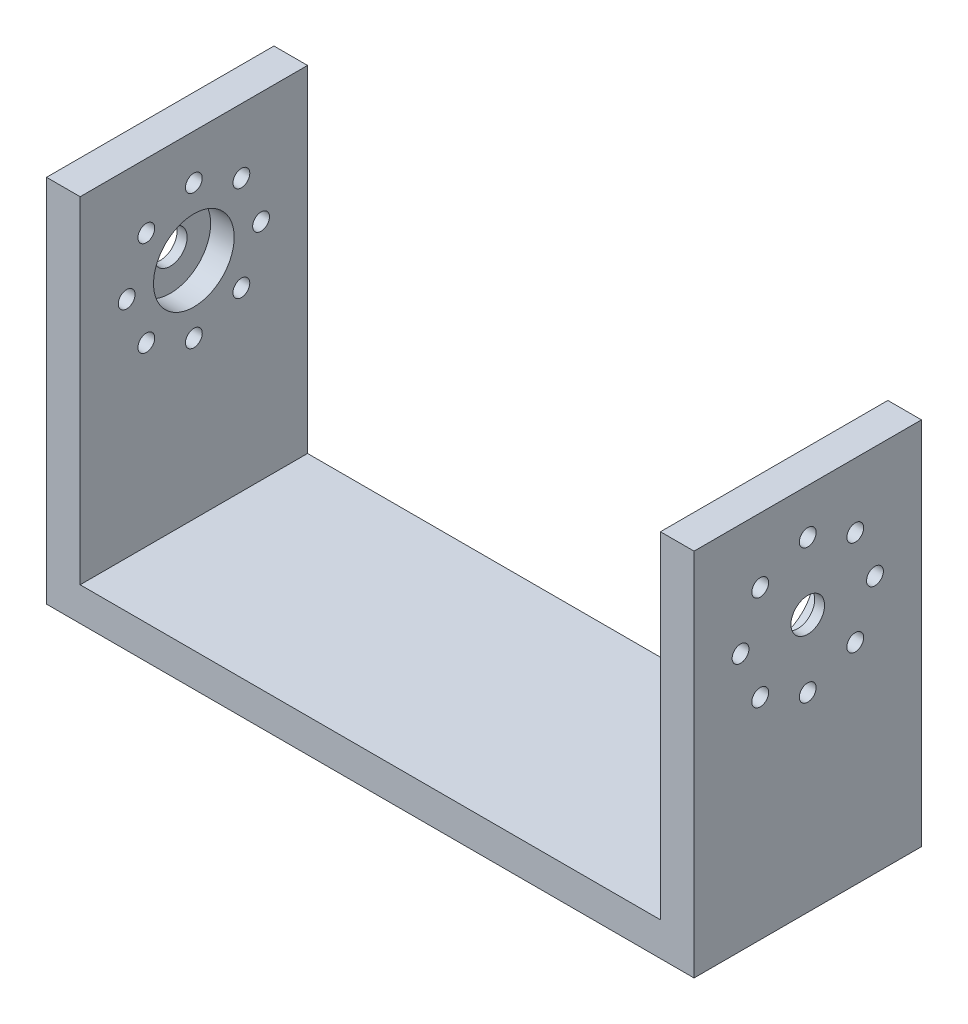
ISO-10303-21;
HEADER;
FILE_DESCRIPTION(('STEP AP214'),'2;1');
FILE_NAME('part.step','',(''),(''),'','','');
FILE_SCHEMA(('AUTOMOTIVE_DESIGN { 1 0 10303 214 1 1 1 1 }'));
ENDSEC;
DATA;
#1=APPLICATION_CONTEXT('core data for automotive mechanical design processes');
#2=APPLICATION_PROTOCOL_DEFINITION('international standard','automotive_design',2000,#1);
#3=PRODUCT_CONTEXT('',#1,'mechanical');
#4=PRODUCT('Part','Part','',(#3));
#5=PRODUCT_RELATED_PRODUCT_CATEGORY('part','',(#4));
#6=PRODUCT_DEFINITION_FORMATION('','',#4);
#7=PRODUCT_DEFINITION_CONTEXT('part definition',#1,'design');
#8=PRODUCT_DEFINITION('design','',#6,#7);
#9=PRODUCT_DEFINITION_SHAPE('','',#8);
#10=(LENGTH_UNIT() NAMED_UNIT(*) SI_UNIT(.MILLI.,.METRE.));
#11=(NAMED_UNIT(*) PLANE_ANGLE_UNIT() SI_UNIT($,.RADIAN.));
#12=(NAMED_UNIT(*) SI_UNIT($,.STERADIAN.) SOLID_ANGLE_UNIT());
#13=UNCERTAINTY_MEASURE_WITH_UNIT(LENGTH_MEASURE(1.E-05),#10,'distance_accuracy_value','');
#14=(GEOMETRIC_REPRESENTATION_CONTEXT(3) GLOBAL_UNCERTAINTY_ASSIGNED_CONTEXT((#13)) GLOBAL_UNIT_ASSIGNED_CONTEXT((#10,
#11,#12)) REPRESENTATION_CONTEXT('',''));
#15=CARTESIAN_POINT('',(0.,0.,0.));
#16=DIRECTION('',(0.,0.,1.));
#17=DIRECTION('',(1.,0.,0.));
#18=AXIS2_PLACEMENT_3D('',#15,#16,#17);
#19=CARTESIAN_POINT('',(-4.2426406871193,23.,-10.15));
#20=DIRECTION('',(1.,0.,0.));
#21=DIRECTION('',(0.,0.,-0.999999999999999));
#22=AXIS2_PLACEMENT_3D('',#19,#20,#21);
#23=CYLINDRICAL_SURFACE('',#22,1.5);
#24=CARTESIAN_POINT('',(0.,22.9999999999999,-10.15));
#25=DIRECTION('',(1.,0.,0.));
#26=DIRECTION('',(0.,0.,-0.999999999999999));
#27=AXIS2_PLACEMENT_3D('',#24,#25,#26);
#28=CIRCLE('',#27,1.5);
#29=CARTESIAN_POINT('',(0.,22.9999999999999,-11.65));
#30=VERTEX_POINT('',#29);
#31=EDGE_CURVE('E184',#30,#30,#28,.F.);
#32=ORIENTED_EDGE('',*,*,#31,.T.);
#33=EDGE_LOOP('',(#32));
#34=FACE_BOUND('',#33,.T.);
#35=CARTESIAN_POINT('',(0.900000000000012,23.,-10.15));
#36=DIRECTION('',(1.,0.,0.));
#37=DIRECTION('',(0.,0.,-0.999999999999999));
#38=AXIS2_PLACEMENT_3D('',#35,#36,#37);
#39=CIRCLE('',#38,1.5);
#40=CARTESIAN_POINT('',(0.900000000000013,23.,-11.65));
#41=VERTEX_POINT('',#40);
#42=EDGE_CURVE('E49',#41,#41,#39,.F.);
#43=ORIENTED_EDGE('',*,*,#42,.F.);
#44=EDGE_LOOP('',(#43));
#45=FACE_BOUND('',#44,.T.);
#46=ADVANCED_FACE('F45',(#34,#45),#23,.F.);
#47=CARTESIAN_POINT('',(57.8000000000001,22.9999999999998,-10.15));
#48=DIRECTION('',(1.,0.,0.));
#49=DIRECTION('',(0.,0.,-0.999999999999999));
#50=AXIS2_PLACEMENT_3D('',#47,#48,#49);
#51=CIRCLE('',#50,1.5);
#52=CARTESIAN_POINT('',(57.8000000000001,22.9999999999998,-11.65));
#53=VERTEX_POINT('',#52);
#54=EDGE_CURVE('E259',#53,#53,#51,.T.);
#55=ORIENTED_EDGE('',*,*,#54,.T.);
#56=EDGE_LOOP('',(#55));
#57=FACE_BOUND('',#56,.T.);
#58=CARTESIAN_POINT('',(56.9200000000001,22.9999999999998,-10.15));
#59=DIRECTION('',(-1.,0.,0.));
#60=DIRECTION('',(0.,0.,0.999999999999999));
#61=AXIS2_PLACEMENT_3D('',#58,#59,#60);
#62=CIRCLE('',#61,1.5);
#63=CARTESIAN_POINT('',(56.9200000000001,22.9999999999998,-8.65000000000003));
#64=VERTEX_POINT('',#63);
#65=EDGE_CURVE('E211',#64,#64,#62,.F.);
#66=ORIENTED_EDGE('',*,*,#65,.F.);
#67=EDGE_LOOP('',(#66));
#68=FACE_BOUND('',#67,.T.);
#69=ADVANCED_FACE('F319',(#57,#68),#23,.F.);
#70=CARTESIAN_POINT('',(0.,3.,0.));
#71=DIRECTION('',(0.,-0.999999999999998,0.));
#72=DIRECTION('',(0.,0.,-0.999999999999999));
#73=AXIS2_PLACEMENT_3D('',#70,#71,#72);
#74=PLANE('',#73);
#75=DIRECTION('',(0.,0.,0.999999999999999));
#76=VECTOR('',#75,1.);
#77=CARTESIAN_POINT('',(54.8000000000001,2.99999999999989,-20.2999999999999));
#78=LINE('',#77,#76);
#79=CARTESIAN_POINT('',(54.8000000000001,2.99999999999989,-20.2999999999999));
#80=VERTEX_POINT('',#79);
#81=CARTESIAN_POINT('',(54.8000000000001,2.99999999999988,0.));
#82=VERTEX_POINT('',#81);
#83=EDGE_CURVE('E136',#80,#82,#78,.T.);
#84=ORIENTED_EDGE('',*,*,#83,.F.);
#85=DIRECTION('',(-1.,0.,0.));
#86=VECTOR('',#85,1.);
#87=CARTESIAN_POINT('',(0.,3.,-20.3));
#88=LINE('',#87,#86);
#89=CARTESIAN_POINT('',(3.,3.,-20.3));
#90=VERTEX_POINT('',#89);
#91=EDGE_CURVE('E168',#80,#90,#88,.T.);
#92=ORIENTED_EDGE('',*,*,#91,.T.);
#93=DIRECTION('',(0.,0.,-0.999999999999999));
#94=VECTOR('',#93,1.);
#95=CARTESIAN_POINT('',(3.,3.,-20.3));
#96=LINE('',#95,#94);
#97=CARTESIAN_POINT('',(3.,3.,0.));
#98=VERTEX_POINT('',#97);
#99=EDGE_CURVE('E67',#98,#90,#96,.T.);
#100=ORIENTED_EDGE('',*,*,#99,.F.);
#101=DIRECTION('',(1.,0.,0.));
#102=VECTOR('',#101,1.);
#103=CARTESIAN_POINT('',(0.,3.,0.));
#104=LINE('',#103,#102);
#105=EDGE_CURVE('E62',#98,#82,#104,.T.);
#106=ORIENTED_EDGE('',*,*,#105,.T.);
#107=EDGE_LOOP('',(#84,#92,#100,#106));
#108=FACE_BOUND('',#107,.T.);
#109=ADVANCED_FACE('F325',(#108),#74,.F.);
#110=CARTESIAN_POINT('',(0.,3.,0.));
#111=DIRECTION('',(1.,0.,0.));
#112=DIRECTION('',(0.,0.,-0.999999999999999));
#113=AXIS2_PLACEMENT_3D('',#110,#111,#112);
#114=PLANE('',#113);
#115=CARTESIAN_POINT('',(0.,23.,-16.15));
#116=DIRECTION('',(1.,0.,0.));
#117=DIRECTION('',(0.,0.,-0.999999999999999));
#118=AXIS2_PLACEMENT_3D('',#115,#116,#117);
#119=CIRCLE('',#118,0.750000000000002);
#120=CARTESIAN_POINT('',(0.,23.,-16.9));
#121=VERTEX_POINT('',#120);
#122=EDGE_CURVE('E255',#121,#121,#119,.F.);
#123=ORIENTED_EDGE('',*,*,#122,.F.);
#124=EDGE_LOOP('',(#123));
#125=FACE_BOUND('',#124,.T.);
#126=CARTESIAN_POINT('',(0.,18.7573593128807,-14.3926406871193));
#127=DIRECTION('',(1.,0.,0.));
#128=DIRECTION('',(0.,0.,-0.999999999999999));
#129=AXIS2_PLACEMENT_3D('',#126,#127,#128);
#130=CIRCLE('',#129,0.750000000000007);
#131=CARTESIAN_POINT('',(0.,18.7573593128807,-15.1426406871193));
#132=VERTEX_POINT('',#131);
#133=EDGE_CURVE('E256',#132,#132,#130,.F.);
#134=ORIENTED_EDGE('',*,*,#133,.F.);
#135=EDGE_LOOP('',(#134));
#136=FACE_BOUND('',#135,.T.);
#137=CARTESIAN_POINT('',(0.,17.,-10.15));
#138=DIRECTION('',(1.,0.,0.));
#139=DIRECTION('',(0.,0.,-0.999999999999999));
#140=AXIS2_PLACEMENT_3D('',#137,#138,#139);
#141=CIRCLE('',#140,0.75);
#142=CARTESIAN_POINT('',(0.,17.,-10.9));
#143=VERTEX_POINT('',#142);
#144=EDGE_CURVE('E263',#143,#143,#141,.F.);
#145=ORIENTED_EDGE('',*,*,#144,.F.);
#146=EDGE_LOOP('',(#145));
#147=FACE_BOUND('',#146,.T.);
#148=CARTESIAN_POINT('',(0.,18.7573593128807,-5.90735931288071));
#149=DIRECTION('',(1.,0.,0.));
#150=DIRECTION('',(0.,0.,-0.999999999999999));
#151=AXIS2_PLACEMENT_3D('',#148,#149,#150);
#152=CIRCLE('',#151,0.750000000000002);
#153=CARTESIAN_POINT('',(0.,18.7573593128807,-6.65735931288071));
#154=VERTEX_POINT('',#153);
#155=EDGE_CURVE('E269',#154,#154,#152,.F.);
#156=ORIENTED_EDGE('',*,*,#155,.F.);
#157=EDGE_LOOP('',(#156));
#158=FACE_BOUND('',#157,.T.);
#159=CARTESIAN_POINT('',(0.,23.,-4.15));
#160=DIRECTION('',(1.,0.,0.));
#161=DIRECTION('',(0.,0.,-0.999999999999999));
#162=AXIS2_PLACEMENT_3D('',#159,#160,#161);
#163=CIRCLE('',#162,0.750000000000004);
#164=CARTESIAN_POINT('',(0.,23.,-4.9));
#165=VERTEX_POINT('',#164);
#166=EDGE_CURVE('E234',#165,#165,#163,.F.);
#167=ORIENTED_EDGE('',*,*,#166,.F.);
#168=EDGE_LOOP('',(#167));
#169=FACE_BOUND('',#168,.T.);
#170=CARTESIAN_POINT('',(0.,27.2426406871193,-5.90735931288069));
#171=DIRECTION('',(1.,0.,0.));
#172=DIRECTION('',(0.,0.,-0.999999999999999));
#173=AXIS2_PLACEMENT_3D('',#170,#171,#172);
#174=CIRCLE('',#173,0.750000000000004);
#175=CARTESIAN_POINT('',(0.,27.2426406871193,-6.6573593128807));
#176=VERTEX_POINT('',#175);
#177=EDGE_CURVE('E235',#176,#176,#174,.F.);
#178=ORIENTED_EDGE('',*,*,#177,.F.);
#179=EDGE_LOOP('',(#178));
#180=FACE_BOUND('',#179,.T.);
#181=CARTESIAN_POINT('',(0.,29.,-10.15));
#182=DIRECTION('',(1.,0.,0.));
#183=DIRECTION('',(0.,0.,-0.999999999999999));
#184=AXIS2_PLACEMENT_3D('',#181,#182,#183);
#185=CIRCLE('',#184,0.750000000000004);
#186=CARTESIAN_POINT('',(0.,29.,-10.9));
#187=VERTEX_POINT('',#186);
#188=EDGE_CURVE('E242',#187,#187,#185,.F.);
#189=ORIENTED_EDGE('',*,*,#188,.F.);
#190=EDGE_LOOP('',(#189));
#191=FACE_BOUND('',#190,.T.);
#192=CARTESIAN_POINT('',(0.,27.2426406871193,-14.3926406871193));
#193=DIRECTION('',(1.,0.,0.));
#194=DIRECTION('',(0.,0.,-0.999999999999999));
#195=AXIS2_PLACEMENT_3D('',#192,#193,#194);
#196=CIRCLE('',#195,0.750000000000002);
#197=CARTESIAN_POINT('',(0.,27.2426406871193,-15.1426406871193));
#198=VERTEX_POINT('',#197);
#199=EDGE_CURVE('E218',#198,#198,#196,.F.);
#200=ORIENTED_EDGE('',*,*,#199,.F.);
#201=EDGE_LOOP('',(#200));
#202=FACE_BOUND('',#201,.T.);
#203=ORIENTED_EDGE('',*,*,#31,.F.);
#204=EDGE_LOOP('',(#203));
#205=FACE_BOUND('',#204,.T.);
#206=DIRECTION('',(0.,0.,0.999999999999999));
#207=VECTOR('',#206,1.);
#208=CARTESIAN_POINT('',(0.,0.,0.));
#209=LINE('',#208,#207);
#210=CARTESIAN_POINT('',(0.,0.,-20.3));
#211=VERTEX_POINT('',#210);
#212=CARTESIAN_POINT('',(0.,0.,0.));
#213=VERTEX_POINT('',#212);
#214=EDGE_CURVE('E166',#211,#213,#209,.T.);
#215=ORIENTED_EDGE('',*,*,#214,.T.);
#216=DIRECTION('',(0.,-0.999999999999998,0.));
#217=VECTOR('',#216,1.);
#218=CARTESIAN_POINT('',(0.,3.,0.));
#219=LINE('',#218,#217);
#220=CARTESIAN_POINT('',(0.,33.,0.));
#221=VERTEX_POINT('',#220);
#222=EDGE_CURVE('E13',#221,#213,#219,.T.);
#223=ORIENTED_EDGE('',*,*,#222,.F.);
#224=DIRECTION('',(0.,0.,0.999999999999999));
#225=VECTOR('',#224,1.);
#226=CARTESIAN_POINT('',(0.,33.,-20.3));
#227=LINE('',#226,#225);
#228=CARTESIAN_POINT('',(0.,33.,-20.3));
#229=VERTEX_POINT('',#228);
#230=EDGE_CURVE('E149',#229,#221,#227,.T.);
#231=ORIENTED_EDGE('',*,*,#230,.F.);
#232=DIRECTION('',(0.,-0.999999999999998,0.));
#233=VECTOR('',#232,1.);
#234=CARTESIAN_POINT('',(0.,3.,-20.3));
#235=LINE('',#234,#233);
#236=EDGE_CURVE('E121',#229,#211,#235,.T.);
#237=ORIENTED_EDGE('',*,*,#236,.T.);
#238=EDGE_LOOP('',(#215,#223,#231,#237));
#239=FACE_BOUND('',#238,.T.);
#240=ADVANCED_FACE('F47',(#125,#136,#147,#158,#169,#180,#191,#202,#205,#239),#114,.F.);
#241=CARTESIAN_POINT('',(0.,3.,0.));
#242=DIRECTION('',(0.,0.,-0.999999999999999));
#243=DIRECTION('',(-1.,0.,0.));
#244=AXIS2_PLACEMENT_3D('',#241,#242,#243);
#245=PLANE('',#244);
#246=DIRECTION('',(1.,0.,0.));
#247=VECTOR('',#246,1.);
#248=CARTESIAN_POINT('',(0.,0.,0.));
#249=LINE('',#248,#247);
#250=CARTESIAN_POINT('',(57.8000000000001,-1.38777878078145E-13,0.));
#251=VERTEX_POINT('',#250);
#252=EDGE_CURVE('E173',#213,#251,#249,.T.);
#253=ORIENTED_EDGE('',*,*,#252,.T.);
#254=DIRECTION('',(0.,-0.999999999999998,0.));
#255=VECTOR('',#254,1.);
#256=CARTESIAN_POINT('',(57.8000000000001,2.99999999999996,0.));
#257=LINE('',#256,#255);
#258=CARTESIAN_POINT('',(57.8000000000001,32.9999999999998,0.));
#259=VERTEX_POINT('',#258);
#260=EDGE_CURVE('E54',#259,#251,#257,.T.);
#261=ORIENTED_EDGE('',*,*,#260,.F.);
#262=DIRECTION('',(1.,0.,0.));
#263=VECTOR('',#262,1.);
#264=CARTESIAN_POINT('',(57.8000000000001,32.9999999999998,0.));
#265=LINE('',#264,#263);
#266=CARTESIAN_POINT('',(54.8000000000001,32.9999999999998,0.));
#267=VERTEX_POINT('',#266);
#268=EDGE_CURVE('E135',#267,#259,#265,.T.);
#269=ORIENTED_EDGE('',*,*,#268,.F.);
#270=DIRECTION('',(0.,-0.999999999999998,0.));
#271=VECTOR('',#270,1.);
#272=CARTESIAN_POINT('',(54.8000000000001,32.9999999999998,0.));
#273=LINE('',#272,#271);
#274=EDGE_CURVE('E144',#267,#82,#273,.T.);
#275=ORIENTED_EDGE('',*,*,#274,.T.);
#276=ORIENTED_EDGE('',*,*,#105,.F.);
#277=DIRECTION('',(0.,-0.999999999999998,0.));
#278=VECTOR('',#277,1.);
#279=CARTESIAN_POINT('',(3.00000000000003,33.,0.));
#280=LINE('',#279,#278);
#281=CARTESIAN_POINT('',(3.00000000000003,33.,0.));
#282=VERTEX_POINT('',#281);
#283=EDGE_CURVE('E163',#282,#98,#280,.T.);
#284=ORIENTED_EDGE('',*,*,#283,.F.);
#285=DIRECTION('',(1.,0.,0.));
#286=VECTOR('',#285,1.);
#287=CARTESIAN_POINT('',(0.,33.,0.));
#288=LINE('',#287,#286);
#289=EDGE_CURVE('E152',#221,#282,#288,.T.);
#290=ORIENTED_EDGE('',*,*,#289,.F.);
#291=ORIENTED_EDGE('',*,*,#222,.T.);
#292=EDGE_LOOP('',(#253,#261,#269,#275,#276,#284,#290,#291));
#293=FACE_BOUND('',#292,.T.);
#294=ADVANCED_FACE('F353',(#293),#245,.F.);
#295=CARTESIAN_POINT('',(57.8000000000001,2.99999999999996,0.));
#296=DIRECTION('',(-1.,0.,0.));
#297=DIRECTION('',(0.,0.,0.999999999999999));
#298=AXIS2_PLACEMENT_3D('',#295,#296,#297);
#299=PLANE('',#298);
#300=CARTESIAN_POINT('',(57.8000000000001,22.9999999999999,-16.15));
#301=DIRECTION('',(1.,0.,0.));
#302=DIRECTION('',(0.,0.,-0.999999999999999));
#303=AXIS2_PLACEMENT_3D('',#300,#301,#302);
#304=CIRCLE('',#303,0.750000000000002);
#305=CARTESIAN_POINT('',(57.8000000000001,22.9999999999999,-16.9));
#306=VERTEX_POINT('',#305);
#307=EDGE_CURVE('E252',#306,#306,#304,.T.);
#308=ORIENTED_EDGE('',*,*,#307,.F.);
#309=EDGE_LOOP('',(#308));
#310=FACE_BOUND('',#309,.T.);
#311=CARTESIAN_POINT('',(57.8000000000001,18.7573593128806,-14.3926406871192));
#312=DIRECTION('',(1.,0.,0.));
#313=DIRECTION('',(0.,0.,-0.999999999999999));
#314=AXIS2_PLACEMENT_3D('',#311,#312,#313);
#315=CIRCLE('',#314,0.750000000000007);
#316=CARTESIAN_POINT('',(57.8000000000001,18.7573593128806,-15.1426406871192));
#317=VERTEX_POINT('',#316);
#318=EDGE_CURVE('E260',#317,#317,#315,.T.);
#319=ORIENTED_EDGE('',*,*,#318,.F.);
#320=EDGE_LOOP('',(#319));
#321=FACE_BOUND('',#320,.T.);
#322=CARTESIAN_POINT('',(57.8000000000001,16.9999999999999,-10.15));
#323=DIRECTION('',(1.,0.,0.));
#324=DIRECTION('',(0.,0.,-0.999999999999999));
#325=AXIS2_PLACEMENT_3D('',#322,#323,#324);
#326=CIRCLE('',#325,0.75);
#327=CARTESIAN_POINT('',(57.8000000000001,16.9999999999999,-10.9));
#328=VERTEX_POINT('',#327);
#329=EDGE_CURVE('E266',#328,#328,#326,.T.);
#330=ORIENTED_EDGE('',*,*,#329,.F.);
#331=EDGE_LOOP('',(#330));
#332=FACE_BOUND('',#331,.T.);
#333=CARTESIAN_POINT('',(57.8000000000001,18.7573593128805,-5.90735931288075));
#334=DIRECTION('',(1.,0.,0.));
#335=DIRECTION('',(0.,0.,-0.999999999999999));
#336=AXIS2_PLACEMENT_3D('',#333,#334,#335);
#337=CIRCLE('',#336,0.750000000000002);
#338=CARTESIAN_POINT('',(57.8000000000001,18.7573593128805,-6.65735931288075));
#339=VERTEX_POINT('',#338);
#340=EDGE_CURVE('E238',#339,#339,#337,.T.);
#341=ORIENTED_EDGE('',*,*,#340,.F.);
#342=EDGE_LOOP('',(#341));
#343=FACE_BOUND('',#342,.T.);
#344=CARTESIAN_POINT('',(57.8000000000001,22.9999999999999,-4.14999999999999));
#345=DIRECTION('',(1.,0.,0.));
#346=DIRECTION('',(0.,0.,-0.999999999999999));
#347=AXIS2_PLACEMENT_3D('',#344,#345,#346);
#348=CIRCLE('',#347,0.750000000000004);
#349=CARTESIAN_POINT('',(57.8000000000001,22.9999999999999,-4.89999999999999));
#350=VERTEX_POINT('',#349);
#351=EDGE_CURVE('E231',#350,#350,#348,.T.);
#352=ORIENTED_EDGE('',*,*,#351,.F.);
#353=EDGE_LOOP('',(#352));
#354=FACE_BOUND('',#353,.T.);
#355=CARTESIAN_POINT('',(57.8000000000001,27.2426406871191,-5.90735931288068));
#356=DIRECTION('',(1.,0.,0.));
#357=DIRECTION('',(0.,0.,-0.999999999999999));
#358=AXIS2_PLACEMENT_3D('',#355,#356,#357);
#359=CIRCLE('',#358,0.750000000000004);
#360=CARTESIAN_POINT('',(57.8000000000001,27.2426406871191,-6.65735931288068));
#361=VERTEX_POINT('',#360);
#362=EDGE_CURVE('E239',#361,#361,#359,.T.);
#363=ORIENTED_EDGE('',*,*,#362,.F.);
#364=EDGE_LOOP('',(#363));
#365=FACE_BOUND('',#364,.T.);
#366=CARTESIAN_POINT('',(57.8000000000001,28.9999999999998,-10.15));
#367=DIRECTION('',(1.,0.,0.));
#368=DIRECTION('',(0.,0.,-0.999999999999999));
#369=AXIS2_PLACEMENT_3D('',#366,#367,#368);
#370=CIRCLE('',#369,0.750000000000004);
#371=CARTESIAN_POINT('',(57.8000000000001,28.9999999999998,-10.9));
#372=VERTEX_POINT('',#371);
#373=EDGE_CURVE('E245',#372,#372,#370,.T.);
#374=ORIENTED_EDGE('',*,*,#373,.F.);
#375=EDGE_LOOP('',(#374));
#376=FACE_BOUND('',#375,.T.);
#377=CARTESIAN_POINT('',(57.8000000000001,27.2426406871192,-14.3926406871192));
#378=DIRECTION('',(1.,0.,0.));
#379=DIRECTION('',(0.,0.,-0.999999999999999));
#380=AXIS2_PLACEMENT_3D('',#377,#378,#379);
#381=CIRCLE('',#380,0.750000000000002);
#382=CARTESIAN_POINT('',(57.8000000000001,27.2426406871192,-15.1426406871192));
#383=VERTEX_POINT('',#382);
#384=EDGE_CURVE('E213',#383,#383,#381,.T.);
#385=ORIENTED_EDGE('',*,*,#384,.F.);
#386=EDGE_LOOP('',(#385));
#387=FACE_BOUND('',#386,.T.);
#388=ORIENTED_EDGE('',*,*,#54,.F.);
#389=EDGE_LOOP('',(#388));
#390=FACE_BOUND('',#389,.T.);
#391=DIRECTION('',(0.,0.,-0.999999999999999));
#392=VECTOR('',#391,1.);
#393=CARTESIAN_POINT('',(57.8000000000001,-1.38777878078145E-13,0.));
#394=LINE('',#393,#392);
#395=CARTESIAN_POINT('',(57.8,0.,-20.3));
#396=VERTEX_POINT('',#395);
#397=EDGE_CURVE('E118',#251,#396,#394,.T.);
#398=ORIENTED_EDGE('',*,*,#397,.T.);
#399=DIRECTION('',(0.,-0.999999999999998,0.));
#400=VECTOR('',#399,1.);
#401=CARTESIAN_POINT('',(57.8000000000001,2.99999999999996,-20.3));
#402=LINE('',#401,#400);
#403=CARTESIAN_POINT('',(57.8000000000001,32.9999999999999,-20.3));
#404=VERTEX_POINT('',#403);
#405=EDGE_CURVE('E111',#404,#396,#402,.T.);
#406=ORIENTED_EDGE('',*,*,#405,.F.);
#407=DIRECTION('',(0.,0.,-0.999999999999999));
#408=VECTOR('',#407,1.);
#409=CARTESIAN_POINT('',(57.8000000000001,32.9999999999999,-20.3));
#410=LINE('',#409,#408);
#411=EDGE_CURVE('E116',#259,#404,#410,.T.);
#412=ORIENTED_EDGE('',*,*,#411,.F.);
#413=ORIENTED_EDGE('',*,*,#260,.T.);
#414=EDGE_LOOP('',(#398,#406,#412,#413));
#415=FACE_BOUND('',#414,.T.);
#416=ADVANCED_FACE('F113',(#310,#321,#332,#343,#354,#365,#376,#387,#390,#415),#299,.F.);
#417=CARTESIAN_POINT('',(0.,3.,-20.3));
#418=DIRECTION('',(0.,0.,0.999999999999999));
#419=DIRECTION('',(1.,0.,0.));
#420=AXIS2_PLACEMENT_3D('',#417,#418,#419);
#421=PLANE('',#420);
#422=DIRECTION('',(-1.,0.,0.));
#423=VECTOR('',#422,1.);
#424=CARTESIAN_POINT('',(0.,0.,-20.3));
#425=LINE('',#424,#423);
#426=EDGE_CURVE('E169',#396,#211,#425,.T.);
#427=ORIENTED_EDGE('',*,*,#426,.T.);
#428=ORIENTED_EDGE('',*,*,#236,.F.);
#429=DIRECTION('',(-1.,0.,0.));
#430=VECTOR('',#429,1.);
#431=CARTESIAN_POINT('',(0.,33.,-20.3));
#432=LINE('',#431,#430);
#433=CARTESIAN_POINT('',(3.0000000000001,32.9999999999999,-20.2999999999999));
#434=VERTEX_POINT('',#433);
#435=EDGE_CURVE('E156',#434,#229,#432,.T.);
#436=ORIENTED_EDGE('',*,*,#435,.F.);
#437=DIRECTION('',(0.,-0.999999999999998,0.));
#438=VECTOR('',#437,1.);
#439=CARTESIAN_POINT('',(3.0000000000001,32.9999999999999,-20.2999999999999));
#440=LINE('',#439,#438);
#441=EDGE_CURVE('E159',#434,#90,#440,.T.);
#442=ORIENTED_EDGE('',*,*,#441,.T.);
#443=ORIENTED_EDGE('',*,*,#91,.F.);
#444=DIRECTION('',(0.,-0.999999999999998,0.));
#445=VECTOR('',#444,1.);
#446=CARTESIAN_POINT('',(54.8000000000001,32.9999999999999,-20.3000000000001));
#447=LINE('',#446,#445);
#448=CARTESIAN_POINT('',(54.8000000000001,32.9999999999999,-20.3000000000001));
#449=VERTEX_POINT('',#448);
#450=EDGE_CURVE('E127',#449,#80,#447,.T.);
#451=ORIENTED_EDGE('',*,*,#450,.F.);
#452=DIRECTION('',(-1.,0.,0.));
#453=VECTOR('',#452,1.);
#454=CARTESIAN_POINT('',(57.8000000000001,32.9999999999999,-20.3));
#455=LINE('',#454,#453);
#456=EDGE_CURVE('E124',#404,#449,#455,.T.);
#457=ORIENTED_EDGE('',*,*,#456,.F.);
#458=ORIENTED_EDGE('',*,*,#405,.T.);
#459=EDGE_LOOP('',(#427,#428,#436,#442,#443,#451,#457,#458));
#460=FACE_BOUND('',#459,.T.);
#461=ADVANCED_FACE('F125',(#460),#421,.F.);
#462=CARTESIAN_POINT('',(0.,0.,0.));
#463=DIRECTION('',(0.,-0.999999999999998,0.));
#464=DIRECTION('',(0.,0.,-0.999999999999999));
#465=AXIS2_PLACEMENT_3D('',#462,#463,#464);
#466=PLANE('',#465);
#467=ORIENTED_EDGE('',*,*,#214,.F.);
#468=ORIENTED_EDGE('',*,*,#426,.F.);
#469=ORIENTED_EDGE('',*,*,#397,.F.);
#470=ORIENTED_EDGE('',*,*,#252,.F.);
#471=EDGE_LOOP('',(#467,#468,#469,#470));
#472=FACE_BOUND('',#471,.T.);
#473=ADVANCED_FACE('F343',(#472),#466,.T.);
#474=CARTESIAN_POINT('',(3.0000000000001,32.9999999999999,-20.2999999999999));
#475=DIRECTION('',(-1.,0.,0.));
#476=DIRECTION('',(0.,0.,0.999999999999999));
#477=AXIS2_PLACEMENT_3D('',#474,#475,#476);
#478=PLANE('',#477);
#479=CARTESIAN_POINT('',(3.,23.,-10.15));
#480=DIRECTION('',(1.,0.,0.));
#481=DIRECTION('',(0.,0.,-0.999999999999999));
#482=AXIS2_PLACEMENT_3D('',#479,#480,#481);
#483=CIRCLE('',#482,3.6);
#484=CARTESIAN_POINT('',(3.,23.,-13.75));
#485=VERTEX_POINT('',#484);
#486=EDGE_CURVE('E228',#485,#485,#483,.T.);
#487=ORIENTED_EDGE('',*,*,#486,.F.);
#488=EDGE_LOOP('',(#487));
#489=FACE_BOUND('',#488,.T.);
#490=CARTESIAN_POINT('',(3.,23.,-16.15));
#491=DIRECTION('',(-1.,0.,0.));
#492=DIRECTION('',(0.,0.,0.999999999999999));
#493=AXIS2_PLACEMENT_3D('',#490,#491,#492);
#494=CIRCLE('',#493,0.750000000000002);
#495=CARTESIAN_POINT('',(3.,23.,-15.4));
#496=VERTEX_POINT('',#495);
#497=EDGE_CURVE('E138',#496,#496,#494,.T.);
#498=ORIENTED_EDGE('',*,*,#497,.T.);
#499=EDGE_LOOP('',(#498));
#500=FACE_BOUND('',#499,.T.);
#501=CARTESIAN_POINT('',(3.,18.7573593128807,-14.3926406871193));
#502=DIRECTION('',(-1.,0.,0.));
#503=DIRECTION('',(0.,0.,0.999999999999999));
#504=AXIS2_PLACEMENT_3D('',#501,#502,#503);
#505=CIRCLE('',#504,0.750000000000007);
#506=CARTESIAN_POINT('',(3.,18.7573593128807,-13.6426406871193));
#507=VERTEX_POINT('',#506);
#508=EDGE_CURVE('E208',#507,#507,#505,.T.);
#509=ORIENTED_EDGE('',*,*,#508,.T.);
#510=EDGE_LOOP('',(#509));
#511=FACE_BOUND('',#510,.T.);
#512=CARTESIAN_POINT('',(3.,17.,-10.1499999999999));
#513=DIRECTION('',(-1.,0.,0.));
#514=DIRECTION('',(0.,0.,0.999999999999999));
#515=AXIS2_PLACEMENT_3D('',#512,#513,#514);
#516=CIRCLE('',#515,0.75);
#517=CARTESIAN_POINT('',(3.,17.,-9.39999999999994));
#518=VERTEX_POINT('',#517);
#519=EDGE_CURVE('E204',#518,#518,#516,.T.);
#520=ORIENTED_EDGE('',*,*,#519,.T.);
#521=EDGE_LOOP('',(#520));
#522=FACE_BOUND('',#521,.T.);
#523=CARTESIAN_POINT('',(3.,18.7573593128807,-5.90735931288071));
#524=DIRECTION('',(-1.,0.,0.));
#525=DIRECTION('',(0.,0.,0.999999999999999));
#526=AXIS2_PLACEMENT_3D('',#523,#524,#525);
#527=CIRCLE('',#526,0.750000000000002);
#528=CARTESIAN_POINT('',(3.,18.7573593128807,-5.15735931288071));
#529=VERTEX_POINT('',#528);
#530=EDGE_CURVE('E200',#529,#529,#527,.T.);
#531=ORIENTED_EDGE('',*,*,#530,.T.);
#532=EDGE_LOOP('',(#531));
#533=FACE_BOUND('',#532,.T.);
#534=CARTESIAN_POINT('',(3.,23.,-4.15));
#535=DIRECTION('',(-1.,0.,0.));
#536=DIRECTION('',(0.,0.,0.999999999999999));
#537=AXIS2_PLACEMENT_3D('',#534,#535,#536);
#538=CIRCLE('',#537,0.750000000000004);
#539=CARTESIAN_POINT('',(3.,23.,-3.4));
#540=VERTEX_POINT('',#539);
#541=EDGE_CURVE('E196',#540,#540,#538,.T.);
#542=ORIENTED_EDGE('',*,*,#541,.T.);
#543=EDGE_LOOP('',(#542));
#544=FACE_BOUND('',#543,.T.);
#545=CARTESIAN_POINT('',(3.,27.2426406871192,-5.90735931288069));
#546=DIRECTION('',(-1.,0.,0.));
#547=DIRECTION('',(0.,0.,0.999999999999999));
#548=AXIS2_PLACEMENT_3D('',#545,#546,#547);
#549=CIRCLE('',#548,0.750000000000004);
#550=CARTESIAN_POINT('',(3.,27.2426406871192,-5.15735931288069));
#551=VERTEX_POINT('',#550);
#552=EDGE_CURVE('E192',#551,#551,#549,.T.);
#553=ORIENTED_EDGE('',*,*,#552,.T.);
#554=EDGE_LOOP('',(#553));
#555=FACE_BOUND('',#554,.T.);
#556=CARTESIAN_POINT('',(3.,29.,-10.15));
#557=DIRECTION('',(-1.,0.,0.));
#558=DIRECTION('',(0.,0.,0.999999999999999));
#559=AXIS2_PLACEMENT_3D('',#556,#557,#558);
#560=CIRCLE('',#559,0.750000000000004);
#561=CARTESIAN_POINT('',(3.,29.,-9.39999999999998));
#562=VERTEX_POINT('',#561);
#563=EDGE_CURVE('E188',#562,#562,#560,.T.);
#564=ORIENTED_EDGE('',*,*,#563,.T.);
#565=EDGE_LOOP('',(#564));
#566=FACE_BOUND('',#565,.T.);
#567=CARTESIAN_POINT('',(3.,27.2426406871193,-14.3926406871192));
#568=DIRECTION('',(-1.,0.,0.));
#569=DIRECTION('',(0.,0.,0.999999999999999));
#570=AXIS2_PLACEMENT_3D('',#567,#568,#569);
#571=CIRCLE('',#570,0.750000000000002);
#572=CARTESIAN_POINT('',(3.,27.2426406871193,-13.6426406871192));
#573=VERTEX_POINT('',#572);
#574=EDGE_CURVE('E183',#573,#573,#571,.T.);
#575=ORIENTED_EDGE('',*,*,#574,.T.);
#576=EDGE_LOOP('',(#575));
#577=FACE_BOUND('',#576,.T.);
#578=ORIENTED_EDGE('',*,*,#99,.T.);
#579=ORIENTED_EDGE('',*,*,#441,.F.);
#580=DIRECTION('',(0.,0.,-0.999999999999999));
#581=VECTOR('',#580,1.);
#582=CARTESIAN_POINT('',(3.0000000000001,32.9999999999999,-20.2999999999999));
#583=LINE('',#582,#581);
#584=EDGE_CURVE('E154',#282,#434,#583,.T.);
#585=ORIENTED_EDGE('',*,*,#584,.F.);
#586=ORIENTED_EDGE('',*,*,#283,.T.);
#587=EDGE_LOOP('',(#578,#579,#585,#586));
#588=FACE_BOUND('',#587,.T.);
#589=ADVANCED_FACE('F294',(#489,#500,#511,#522,#533,#544,#555,#566,#577,#588),#478,.F.);
#590=CARTESIAN_POINT('',(0.,33.,0.));
#591=DIRECTION('',(0.,0.999999999999998,0.));
#592=DIRECTION('',(0.,0.,0.999999999999999));
#593=AXIS2_PLACEMENT_3D('',#590,#591,#592);
#594=PLANE('',#593);
#595=ORIENTED_EDGE('',*,*,#230,.T.);
#596=ORIENTED_EDGE('',*,*,#289,.T.);
#597=ORIENTED_EDGE('',*,*,#584,.T.);
#598=ORIENTED_EDGE('',*,*,#435,.T.);
#599=EDGE_LOOP('',(#595,#596,#597,#598));
#600=FACE_BOUND('',#599,.T.);
#601=ADVANCED_FACE('F336',(#600),#594,.T.);
#602=CARTESIAN_POINT('',(54.8000000000001,32.9999999999999,-20.3000000000001));
#603=DIRECTION('',(1.,0.,0.));
#604=DIRECTION('',(0.,0.,-0.999999999999999));
#605=AXIS2_PLACEMENT_3D('',#602,#603,#604);
#606=PLANE('',#605);
#607=CARTESIAN_POINT('',(54.8000000000001,22.9999999999998,-10.15));
#608=DIRECTION('',(-1.,0.,0.));
#609=DIRECTION('',(0.,0.,0.999999999999999));
#610=AXIS2_PLACEMENT_3D('',#607,#608,#609);
#611=CIRCLE('',#610,3.6);
#612=CARTESIAN_POINT('',(54.8000000000001,22.9999999999998,-6.55000000000002));
#613=VERTEX_POINT('',#612);
#614=EDGE_CURVE('E221',#613,#613,#611,.T.);
#615=ORIENTED_EDGE('',*,*,#614,.F.);
#616=EDGE_LOOP('',(#615));
#617=FACE_BOUND('',#616,.T.);
#618=CARTESIAN_POINT('',(54.8000000000001,22.9999999999998,-16.15));
#619=DIRECTION('',(1.,0.,0.));
#620=DIRECTION('',(0.,0.,-0.999999999999999));
#621=AXIS2_PLACEMENT_3D('',#618,#619,#620);
#622=CIRCLE('',#621,0.750000000000002);
#623=CARTESIAN_POINT('',(54.8000000000001,22.9999999999998,-16.9));
#624=VERTEX_POINT('',#623);
#625=EDGE_CURVE('E209',#624,#624,#622,.T.);
#626=ORIENTED_EDGE('',*,*,#625,.T.);
#627=EDGE_LOOP('',(#626));
#628=FACE_BOUND('',#627,.T.);
#629=CARTESIAN_POINT('',(54.8000000000001,18.7573593128806,-14.3926406871193));
#630=DIRECTION('',(1.,0.,0.));
#631=DIRECTION('',(0.,0.,-0.999999999999999));
#632=AXIS2_PLACEMENT_3D('',#629,#630,#631);
#633=CIRCLE('',#632,0.750000000000007);
#634=CARTESIAN_POINT('',(54.8000000000001,18.7573593128806,-15.1426406871193));
#635=VERTEX_POINT('',#634);
#636=EDGE_CURVE('E205',#635,#635,#633,.T.);
#637=ORIENTED_EDGE('',*,*,#636,.T.);
#638=EDGE_LOOP('',(#637));
#639=FACE_BOUND('',#638,.T.);
#640=CARTESIAN_POINT('',(54.8000000000001,16.9999999999999,-10.15));
#641=DIRECTION('',(1.,0.,0.));
#642=DIRECTION('',(0.,0.,-0.999999999999999));
#643=AXIS2_PLACEMENT_3D('',#640,#641,#642);
#644=CIRCLE('',#643,0.75);
#645=CARTESIAN_POINT('',(54.8000000000001,16.9999999999999,-10.9));
#646=VERTEX_POINT('',#645);
#647=EDGE_CURVE('E201',#646,#646,#644,.T.);
#648=ORIENTED_EDGE('',*,*,#647,.T.);
#649=EDGE_LOOP('',(#648));
#650=FACE_BOUND('',#649,.T.);
#651=CARTESIAN_POINT('',(54.8000000000001,18.7573593128805,-5.90735931288069));
#652=DIRECTION('',(1.,0.,0.));
#653=DIRECTION('',(0.,0.,-0.999999999999999));
#654=AXIS2_PLACEMENT_3D('',#651,#652,#653);
#655=CIRCLE('',#654,0.750000000000002);
#656=CARTESIAN_POINT('',(54.8000000000001,18.7573593128805,-6.6573593128807));
#657=VERTEX_POINT('',#656);
#658=EDGE_CURVE('E197',#657,#657,#655,.T.);
#659=ORIENTED_EDGE('',*,*,#658,.T.);
#660=EDGE_LOOP('',(#659));
#661=FACE_BOUND('',#660,.T.);
#662=CARTESIAN_POINT('',(54.8000000000001,22.9999999999999,-4.15000000000001));
#663=DIRECTION('',(1.,0.,0.));
#664=DIRECTION('',(0.,0.,-0.999999999999999));
#665=AXIS2_PLACEMENT_3D('',#662,#663,#664);
#666=CIRCLE('',#665,0.750000000000004);
#667=CARTESIAN_POINT('',(54.8000000000001,22.9999999999999,-4.90000000000002));
#668=VERTEX_POINT('',#667);
#669=EDGE_CURVE('E193',#668,#668,#666,.T.);
#670=ORIENTED_EDGE('',*,*,#669,.T.);
#671=EDGE_LOOP('',(#670));
#672=FACE_BOUND('',#671,.T.);
#673=CARTESIAN_POINT('',(54.8000000000001,27.2426406871191,-5.90735931288072));
#674=DIRECTION('',(1.,0.,0.));
#675=DIRECTION('',(0.,0.,-0.999999999999999));
#676=AXIS2_PLACEMENT_3D('',#673,#674,#675);
#677=CIRCLE('',#676,0.750000000000004);
#678=CARTESIAN_POINT('',(54.8000000000001,27.2426406871191,-6.65735931288073));
#679=VERTEX_POINT('',#678);
#680=EDGE_CURVE('E189',#679,#679,#677,.T.);
#681=ORIENTED_EDGE('',*,*,#680,.T.);
#682=EDGE_LOOP('',(#681));
#683=FACE_BOUND('',#682,.T.);
#684=CARTESIAN_POINT('',(54.8000000000001,28.9999999999998,-10.15));
#685=DIRECTION('',(1.,0.,0.));
#686=DIRECTION('',(0.,0.,-0.999999999999999));
#687=AXIS2_PLACEMENT_3D('',#684,#685,#686);
#688=CIRCLE('',#687,0.750000000000004);
#689=CARTESIAN_POINT('',(54.8000000000001,28.9999999999998,-10.9));
#690=VERTEX_POINT('',#689);
#691=EDGE_CURVE('E185',#690,#690,#688,.T.);
#692=ORIENTED_EDGE('',*,*,#691,.T.);
#693=EDGE_LOOP('',(#692));
#694=FACE_BOUND('',#693,.T.);
#695=CARTESIAN_POINT('',(54.8000000000001,27.2426406871192,-14.3926406871192));
#696=DIRECTION('',(1.,0.,0.));
#697=DIRECTION('',(0.,0.,-0.999999999999999));
#698=AXIS2_PLACEMENT_3D('',#695,#696,#697);
#699=CIRCLE('',#698,0.750000000000002);
#700=CARTESIAN_POINT('',(54.8000000000001,27.2426406871192,-15.1426406871193));
#701=VERTEX_POINT('',#700);
#702=EDGE_CURVE('E180',#701,#701,#699,.T.);
#703=ORIENTED_EDGE('',*,*,#702,.T.);
#704=EDGE_LOOP('',(#703));
#705=FACE_BOUND('',#704,.T.);
#706=ORIENTED_EDGE('',*,*,#83,.T.);
#707=ORIENTED_EDGE('',*,*,#274,.F.);
#708=DIRECTION('',(0.,0.,0.999999999999999));
#709=VECTOR('',#708,1.);
#710=CARTESIAN_POINT('',(54.8000000000001,32.9999999999999,-20.3000000000001));
#711=LINE('',#710,#709);
#712=EDGE_CURVE('E130',#449,#267,#711,.T.);
#713=ORIENTED_EDGE('',*,*,#712,.F.);
#714=ORIENTED_EDGE('',*,*,#450,.T.);
#715=EDGE_LOOP('',(#706,#707,#713,#714));
#716=FACE_BOUND('',#715,.T.);
#717=ADVANCED_FACE('F333',(#617,#628,#639,#650,#661,#672,#683,#694,#705,#716),#606,.F.);
#718=CARTESIAN_POINT('',(0.,33.,0.));
#719=DIRECTION('',(0.,-0.999999999999998,0.));
#720=DIRECTION('',(0.,0.,-0.999999999999999));
#721=AXIS2_PLACEMENT_3D('',#718,#719,#720);
#722=PLANE('',#721);
#723=ORIENTED_EDGE('',*,*,#411,.T.);
#724=ORIENTED_EDGE('',*,*,#456,.T.);
#725=ORIENTED_EDGE('',*,*,#712,.T.);
#726=ORIENTED_EDGE('',*,*,#268,.T.);
#727=EDGE_LOOP('',(#723,#724,#725,#726));
#728=FACE_BOUND('',#727,.T.);
#729=ADVANCED_FACE('F133',(#728),#722,.F.);
#730=CARTESIAN_POINT('',(-4.24264068711928,27.2426406871193,-14.3926406871193));
#731=DIRECTION('',(1.,0.,0.));
#732=DIRECTION('',(0.,0.,-0.999999999999999));
#733=AXIS2_PLACEMENT_3D('',#730,#731,#732);
#734=CYLINDRICAL_SURFACE('',#733,0.750000000000002);
#735=ORIENTED_EDGE('',*,*,#384,.T.);
#736=EDGE_LOOP('',(#735));
#737=FACE_BOUND('',#736,.T.);
#738=ORIENTED_EDGE('',*,*,#702,.F.);
#739=EDGE_LOOP('',(#738));
#740=FACE_BOUND('',#739,.T.);
#741=ADVANCED_FACE('F332',(#737,#740),#734,.F.);
#742=CARTESIAN_POINT('',(-4.2426406871193,29.,-10.15));
#743=DIRECTION('',(1.,0.,0.));
#744=DIRECTION('',(0.,0.,-0.999999999999999));
#745=AXIS2_PLACEMENT_3D('',#742,#743,#744);
#746=CYLINDRICAL_SURFACE('',#745,0.750000000000004);
#747=ORIENTED_EDGE('',*,*,#373,.T.);
#748=EDGE_LOOP('',(#747));
#749=FACE_BOUND('',#748,.T.);
#750=ORIENTED_EDGE('',*,*,#691,.F.);
#751=EDGE_LOOP('',(#750));
#752=FACE_BOUND('',#751,.T.);
#753=ADVANCED_FACE('F406',(#749,#752),#746,.F.);
#754=CARTESIAN_POINT('',(-4.2426406871193,27.2426406871193,-5.90735931288071));
#755=DIRECTION('',(1.,0.,0.));
#756=DIRECTION('',(0.,0.,-0.999999999999999));
#757=AXIS2_PLACEMENT_3D('',#754,#755,#756);
#758=CYLINDRICAL_SURFACE('',#757,0.750000000000004);
#759=ORIENTED_EDGE('',*,*,#362,.T.);
#760=EDGE_LOOP('',(#759));
#761=FACE_BOUND('',#760,.T.);
#762=ORIENTED_EDGE('',*,*,#680,.F.);
#763=EDGE_LOOP('',(#762));
#764=FACE_BOUND('',#763,.T.);
#765=ADVANCED_FACE('F413',(#761,#764),#758,.F.);
#766=CARTESIAN_POINT('',(-4.24264068711927,23.,-4.14999999999999));
#767=DIRECTION('',(1.,0.,0.));
#768=DIRECTION('',(0.,0.,-0.999999999999999));
#769=AXIS2_PLACEMENT_3D('',#766,#767,#768);
#770=CYLINDRICAL_SURFACE('',#769,0.750000000000004);
#771=ORIENTED_EDGE('',*,*,#351,.T.);
#772=EDGE_LOOP('',(#771));
#773=FACE_BOUND('',#772,.T.);
#774=ORIENTED_EDGE('',*,*,#669,.F.);
#775=EDGE_LOOP('',(#774));
#776=FACE_BOUND('',#775,.T.);
#777=ADVANCED_FACE('F426',(#773,#776),#770,.F.);
#778=CARTESIAN_POINT('',(-4.2426406871193,18.7573593128807,-5.90735931288071));
#779=DIRECTION('',(1.,0.,0.));
#780=DIRECTION('',(0.,0.,-0.999999999999999));
#781=AXIS2_PLACEMENT_3D('',#778,#779,#780);
#782=CYLINDRICAL_SURFACE('',#781,0.750000000000002);
#783=ORIENTED_EDGE('',*,*,#340,.T.);
#784=EDGE_LOOP('',(#783));
#785=FACE_BOUND('',#784,.T.);
#786=ORIENTED_EDGE('',*,*,#658,.F.);
#787=EDGE_LOOP('',(#786));
#788=FACE_BOUND('',#787,.T.);
#789=ADVANCED_FACE('F556',(#785,#788),#782,.F.);
#790=CARTESIAN_POINT('',(-4.24264068711928,17.,-10.15));
#791=DIRECTION('',(1.,0.,0.));
#792=DIRECTION('',(0.,0.,-0.999999999999999));
#793=AXIS2_PLACEMENT_3D('',#790,#791,#792);
#794=CYLINDRICAL_SURFACE('',#793,0.75);
#795=ORIENTED_EDGE('',*,*,#329,.T.);
#796=EDGE_LOOP('',(#795));
#797=FACE_BOUND('',#796,.T.);
#798=ORIENTED_EDGE('',*,*,#647,.F.);
#799=EDGE_LOOP('',(#798));
#800=FACE_BOUND('',#799,.T.);
#801=ADVANCED_FACE('F315',(#797,#800),#794,.F.);
#802=CARTESIAN_POINT('',(-4.2426406871193,18.7573593128807,-14.3926406871193));
#803=DIRECTION('',(1.,0.,0.));
#804=DIRECTION('',(0.,0.,-0.999999999999999));
#805=AXIS2_PLACEMENT_3D('',#802,#803,#804);
#806=CYLINDRICAL_SURFACE('',#805,0.750000000000007);
#807=ORIENTED_EDGE('',*,*,#318,.T.);
#808=EDGE_LOOP('',(#807));
#809=FACE_BOUND('',#808,.T.);
#810=ORIENTED_EDGE('',*,*,#636,.F.);
#811=EDGE_LOOP('',(#810));
#812=FACE_BOUND('',#811,.T.);
#813=ADVANCED_FACE('F303',(#809,#812),#806,.F.);
#814=CARTESIAN_POINT('',(-4.2426406871193,23.,-16.15));
#815=DIRECTION('',(1.,0.,0.));
#816=DIRECTION('',(0.,0.,-0.999999999999999));
#817=AXIS2_PLACEMENT_3D('',#814,#815,#816);
#818=CYLINDRICAL_SURFACE('',#817,0.750000000000002);
#819=ORIENTED_EDGE('',*,*,#307,.T.);
#820=EDGE_LOOP('',(#819));
#821=FACE_BOUND('',#820,.T.);
#822=ORIENTED_EDGE('',*,*,#625,.F.);
#823=EDGE_LOOP('',(#822));
#824=FACE_BOUND('',#823,.T.);
#825=ADVANCED_FACE('F311',(#821,#824),#818,.F.);
#826=ORIENTED_EDGE('',*,*,#199,.T.);
#827=EDGE_LOOP('',(#826));
#828=FACE_BOUND('',#827,.T.);
#829=ORIENTED_EDGE('',*,*,#574,.F.);
#830=EDGE_LOOP('',(#829));
#831=FACE_BOUND('',#830,.T.);
#832=ADVANCED_FACE('F392',(#828,#831),#734,.F.);
#833=ORIENTED_EDGE('',*,*,#188,.T.);
#834=EDGE_LOOP('',(#833));
#835=FACE_BOUND('',#834,.T.);
#836=ORIENTED_EDGE('',*,*,#563,.F.);
#837=EDGE_LOOP('',(#836));
#838=FACE_BOUND('',#837,.T.);
#839=ADVANCED_FACE('F395',(#835,#838),#746,.F.);
#840=ORIENTED_EDGE('',*,*,#177,.T.);
#841=EDGE_LOOP('',(#840));
#842=FACE_BOUND('',#841,.T.);
#843=ORIENTED_EDGE('',*,*,#552,.F.);
#844=EDGE_LOOP('',(#843));
#845=FACE_BOUND('',#844,.T.);
#846=ADVANCED_FACE('F403',(#842,#845),#758,.F.);
#847=ORIENTED_EDGE('',*,*,#166,.T.);
#848=EDGE_LOOP('',(#847));
#849=FACE_BOUND('',#848,.T.);
#850=ORIENTED_EDGE('',*,*,#541,.F.);
#851=EDGE_LOOP('',(#850));
#852=FACE_BOUND('',#851,.T.);
#853=ADVANCED_FACE('F432',(#849,#852),#770,.F.);
#854=ORIENTED_EDGE('',*,*,#155,.T.);
#855=EDGE_LOOP('',(#854));
#856=FACE_BOUND('',#855,.T.);
#857=ORIENTED_EDGE('',*,*,#530,.F.);
#858=EDGE_LOOP('',(#857));
#859=FACE_BOUND('',#858,.T.);
#860=ADVANCED_FACE('F312',(#856,#859),#782,.F.);
#861=ORIENTED_EDGE('',*,*,#144,.T.);
#862=EDGE_LOOP('',(#861));
#863=FACE_BOUND('',#862,.T.);
#864=ORIENTED_EDGE('',*,*,#519,.F.);
#865=EDGE_LOOP('',(#864));
#866=FACE_BOUND('',#865,.T.);
#867=ADVANCED_FACE('F300',(#863,#866),#794,.F.);
#868=ORIENTED_EDGE('',*,*,#133,.T.);
#869=EDGE_LOOP('',(#868));
#870=FACE_BOUND('',#869,.T.);
#871=ORIENTED_EDGE('',*,*,#508,.F.);
#872=EDGE_LOOP('',(#871));
#873=FACE_BOUND('',#872,.T.);
#874=ADVANCED_FACE('F297',(#870,#873),#806,.F.);
#875=ORIENTED_EDGE('',*,*,#122,.T.);
#876=EDGE_LOOP('',(#875));
#877=FACE_BOUND('',#876,.T.);
#878=ORIENTED_EDGE('',*,*,#497,.F.);
#879=EDGE_LOOP('',(#878));
#880=FACE_BOUND('',#879,.T.);
#881=ADVANCED_FACE('F299',(#877,#880),#818,.F.);
#882=CARTESIAN_POINT('',(56.9200000000001,22.9999999999998,-10.15));
#883=DIRECTION('',(-1.,0.,0.));
#884=DIRECTION('',(0.,0.,0.999999999999999));
#885=AXIS2_PLACEMENT_3D('',#882,#883,#884);
#886=PLANE('',#885);
#887=CARTESIAN_POINT('',(56.9200000000001,22.9999999999998,-10.15));
#888=DIRECTION('',(-1.,0.,0.));
#889=DIRECTION('',(0.,0.,0.999999999999999));
#890=AXIS2_PLACEMENT_3D('',#887,#888,#889);
#891=CIRCLE('',#890,3.6);
#892=CARTESIAN_POINT('',(56.9200000000001,22.9999999999998,-6.55000000000004));
#893=VERTEX_POINT('',#892);
#894=EDGE_CURVE('E214',#893,#893,#891,.T.);
#895=ORIENTED_EDGE('',*,*,#894,.T.);
#896=EDGE_LOOP('',(#895));
#897=FACE_BOUND('',#896,.T.);
#898=ORIENTED_EDGE('',*,*,#65,.T.);
#899=EDGE_LOOP('',(#898));
#900=FACE_BOUND('',#899,.T.);
#901=ADVANCED_FACE('F308',(#897,#900),#886,.T.);
#902=CARTESIAN_POINT('',(56.9200000000001,22.9999999999998,-10.15));
#903=DIRECTION('',(-1.,0.,0.));
#904=DIRECTION('',(0.,0.,0.999999999999999));
#905=AXIS2_PLACEMENT_3D('',#902,#903,#904);
#906=CYLINDRICAL_SURFACE('',#905,3.6);
#907=ORIENTED_EDGE('',*,*,#894,.F.);
#908=EDGE_LOOP('',(#907));
#909=FACE_BOUND('',#908,.T.);
#910=ORIENTED_EDGE('',*,*,#614,.T.);
#911=EDGE_LOOP('',(#910));
#912=FACE_BOUND('',#911,.T.);
#913=ADVANCED_FACE('F437',(#909,#912),#906,.F.);
#914=CARTESIAN_POINT('',(0.900000000000012,23.,-10.15));
#915=DIRECTION('',(1.,0.,0.));
#916=DIRECTION('',(0.,0.,-0.999999999999999));
#917=AXIS2_PLACEMENT_3D('',#914,#915,#916);
#918=PLANE('',#917);
#919=CARTESIAN_POINT('',(0.900000000000012,23.,-10.15));
#920=DIRECTION('',(1.,0.,0.));
#921=DIRECTION('',(0.,0.,-0.999999999999999));
#922=AXIS2_PLACEMENT_3D('',#919,#920,#921);
#923=CIRCLE('',#922,3.6);
#924=CARTESIAN_POINT('',(0.900000000000014,23.,-13.75));
#925=VERTEX_POINT('',#924);
#926=EDGE_CURVE('E455',#925,#925,#923,.T.);
#927=ORIENTED_EDGE('',*,*,#926,.T.);
#928=EDGE_LOOP('',(#927));
#929=FACE_BOUND('',#928,.T.);
#930=ORIENTED_EDGE('',*,*,#42,.T.);
#931=EDGE_LOOP('',(#930));
#932=FACE_BOUND('',#931,.T.);
#933=ADVANCED_FACE('F440',(#929,#932),#918,.T.);
#934=CARTESIAN_POINT('',(0.900000000000012,23.,-10.15));
#935=DIRECTION('',(1.,0.,0.));
#936=DIRECTION('',(0.,0.,-0.999999999999999));
#937=AXIS2_PLACEMENT_3D('',#934,#935,#936);
#938=CYLINDRICAL_SURFACE('',#937,3.6);
#939=ORIENTED_EDGE('',*,*,#926,.F.);
#940=EDGE_LOOP('',(#939));
#941=FACE_BOUND('',#940,.T.);
#942=ORIENTED_EDGE('',*,*,#486,.T.);
#943=EDGE_LOOP('',(#942));
#944=FACE_BOUND('',#943,.T.);
#945=ADVANCED_FACE('F444',(#941,#944),#938,.F.);
#946=CLOSED_SHELL('',(#46,#69,#109,#240,#294,#416,#461,#473,#589,#601,#717,#729,#741,#753,#765,
#777,#789,#801,#813,#825,#832,#839,#846,#853,#860,#867,#874,#881,#901,#913,#933,#945));
#947=MANIFOLD_SOLID_BREP('B2',#946);
#948=ADVANCED_BREP_SHAPE_REPRESENTATION('',(#18,#947),#14);
#949=SHAPE_DEFINITION_REPRESENTATION(#9,#948);
ENDSEC;
END-ISO-10303-21;
